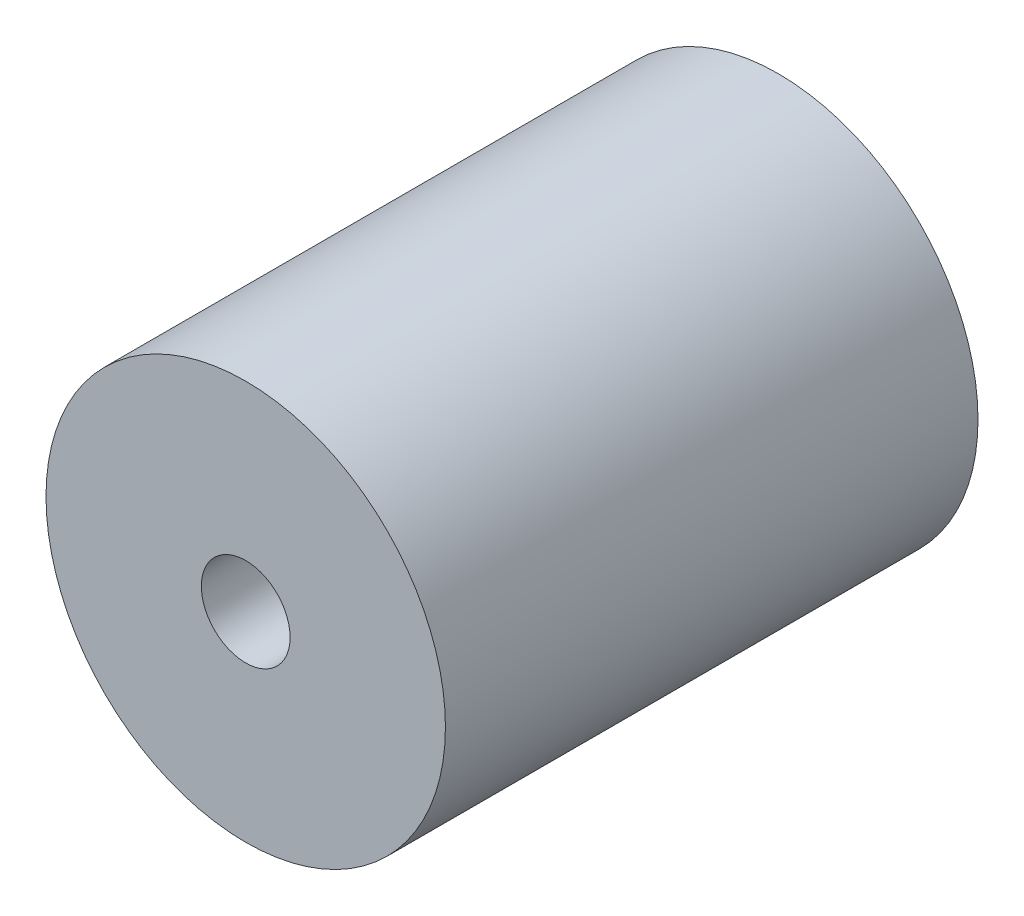
ISO-10303-21;
HEADER;
FILE_DESCRIPTION(('STEP AP214'),'2;1');
FILE_NAME('part.step','',(''),(''),'','','');
FILE_SCHEMA(('AUTOMOTIVE_DESIGN { 1 0 10303 214 1 1 1 1 }'));
ENDSEC;
DATA;
#1=APPLICATION_CONTEXT('core data for automotive mechanical design processes');
#2=APPLICATION_PROTOCOL_DEFINITION('international standard','automotive_design',2000,#1);
#3=PRODUCT_CONTEXT('',#1,'mechanical');
#4=PRODUCT('Part','Part','',(#3));
#5=PRODUCT_RELATED_PRODUCT_CATEGORY('part','',(#4));
#6=PRODUCT_DEFINITION_FORMATION('','',#4);
#7=PRODUCT_DEFINITION_CONTEXT('part definition',#1,'design');
#8=PRODUCT_DEFINITION('design','',#6,#7);
#9=PRODUCT_DEFINITION_SHAPE('','',#8);
#10=(LENGTH_UNIT() NAMED_UNIT(*) SI_UNIT(.MILLI.,.METRE.));
#11=(NAMED_UNIT(*) PLANE_ANGLE_UNIT() SI_UNIT($,.RADIAN.));
#12=(NAMED_UNIT(*) SI_UNIT($,.STERADIAN.) SOLID_ANGLE_UNIT());
#13=UNCERTAINTY_MEASURE_WITH_UNIT(LENGTH_MEASURE(1.E-05),#10,'distance_accuracy_value','');
#14=(GEOMETRIC_REPRESENTATION_CONTEXT(3) GLOBAL_UNCERTAINTY_ASSIGNED_CONTEXT((#13)) GLOBAL_UNIT_ASSIGNED_CONTEXT((#10,
#11,#12)) REPRESENTATION_CONTEXT('',''));
#15=CARTESIAN_POINT('',(0.,0.,0.));
#16=DIRECTION('',(0.,0.,1.));
#17=DIRECTION('',(1.,0.,0.));
#18=AXIS2_PLACEMENT_3D('',#15,#16,#17);
#19=CARTESIAN_POINT('',(0.,0.,38.1));
#20=DIRECTION('',(0.,0.,-1.));
#21=DIRECTION('',(-1.,0.,0.));
#22=AXIS2_PLACEMENT_3D('',#19,#20,#21);
#23=CYLINDRICAL_SURFACE('',#22,14.2875);
#24=CARTESIAN_POINT('',(0.,0.,38.1));
#25=DIRECTION('',(0.,0.,1.));
#26=DIRECTION('',(1.,0.,0.));
#27=AXIS2_PLACEMENT_3D('',#24,#25,#26);
#28=CIRCLE('',#27,14.2875);
#29=CARTESIAN_POINT('',(-14.2875,0.,38.1));
#30=VERTEX_POINT('',#29);
#31=EDGE_CURVE('E10',#30,#30,#28,.T.);
#32=CARTESIAN_POINT('',(0.,0.,0.));
#33=DIRECTION('',(0.,0.,1.));
#34=DIRECTION('',(1.,0.,0.));
#35=AXIS2_PLACEMENT_3D('',#32,#33,#34);
#36=CIRCLE('',#35,14.2875);
#37=CARTESIAN_POINT('',(-14.2875,0.,0.));
#38=VERTEX_POINT('',#37);
#39=EDGE_CURVE('E33',#38,#38,#36,.T.);
#40=CARTESIAN_POINT('',(-14.2875,0.,38.1));
#41=CARTESIAN_POINT('',(-14.2875,0.,37.703125));
#42=CARTESIAN_POINT('',(-14.2875,0.,37.30625));
#43=CARTESIAN_POINT('',(-14.2875,0.,36.5125));
#44=CARTESIAN_POINT('',(-14.2875,0.,36.115625));
#45=CARTESIAN_POINT('',(-14.2875,0.,35.321875));
#46=CARTESIAN_POINT('',(-14.2875,0.,34.925));
#47=CARTESIAN_POINT('',(-14.2875,0.,34.13125));
#48=CARTESIAN_POINT('',(-14.2875,0.,33.734375));
#49=CARTESIAN_POINT('',(-14.2875,0.,32.940625));
#50=CARTESIAN_POINT('',(-14.2875,0.,32.54375));
#51=CARTESIAN_POINT('',(-14.2875,0.,31.75));
#52=CARTESIAN_POINT('',(-14.2875,0.,31.353125));
#53=CARTESIAN_POINT('',(-14.2875,0.,30.559375));
#54=CARTESIAN_POINT('',(-14.2875,0.,30.1625));
#55=CARTESIAN_POINT('',(-14.2875,0.,29.36875));
#56=CARTESIAN_POINT('',(-14.2875,0.,28.971875));
#57=CARTESIAN_POINT('',(-14.2875,0.,28.178125));
#58=CARTESIAN_POINT('',(-14.2875,0.,27.78125));
#59=CARTESIAN_POINT('',(-14.2875,0.,26.9875));
#60=CARTESIAN_POINT('',(-14.2875,0.,26.590625));
#61=CARTESIAN_POINT('',(-14.2875,0.,25.796875));
#62=CARTESIAN_POINT('',(-14.2875,0.,25.4));
#63=CARTESIAN_POINT('',(-14.2875,0.,24.60625));
#64=CARTESIAN_POINT('',(-14.2875,0.,24.209375));
#65=CARTESIAN_POINT('',(-14.2875,0.,23.415625));
#66=CARTESIAN_POINT('',(-14.2875,0.,23.01875));
#67=CARTESIAN_POINT('',(-14.2875,0.,22.225));
#68=CARTESIAN_POINT('',(-14.2875,0.,21.828125));
#69=CARTESIAN_POINT('',(-14.2875,0.,21.034375));
#70=CARTESIAN_POINT('',(-14.2875,0.,20.6375));
#71=CARTESIAN_POINT('',(-14.2875,0.,19.84375));
#72=CARTESIAN_POINT('',(-14.2875,0.,19.446875));
#73=CARTESIAN_POINT('',(-14.2875,0.,18.653125));
#74=CARTESIAN_POINT('',(-14.2875,0.,18.25625));
#75=CARTESIAN_POINT('',(-14.2875,0.,17.4625));
#76=CARTESIAN_POINT('',(-14.2875,0.,17.065625));
#77=CARTESIAN_POINT('',(-14.2875,0.,16.271875));
#78=CARTESIAN_POINT('',(-14.2875,0.,15.875));
#79=CARTESIAN_POINT('',(-14.2875,0.,15.08125));
#80=CARTESIAN_POINT('',(-14.2875,0.,14.684375));
#81=CARTESIAN_POINT('',(-14.2875,0.,13.890625));
#82=CARTESIAN_POINT('',(-14.2875,0.,13.49375));
#83=CARTESIAN_POINT('',(-14.2875,0.,12.7));
#84=CARTESIAN_POINT('',(-14.2875,0.,12.303125));
#85=CARTESIAN_POINT('',(-14.2875,0.,11.509375));
#86=CARTESIAN_POINT('',(-14.2875,0.,11.1125));
#87=CARTESIAN_POINT('',(-14.2875,0.,10.31875));
#88=CARTESIAN_POINT('',(-14.2875,0.,9.921875));
#89=CARTESIAN_POINT('',(-14.2875,0.,9.128125));
#90=CARTESIAN_POINT('',(-14.2875,0.,8.73125));
#91=CARTESIAN_POINT('',(-14.2875,0.,7.9375));
#92=CARTESIAN_POINT('',(-14.2875,0.,7.540625));
#93=CARTESIAN_POINT('',(-14.2875,0.,6.746875));
#94=CARTESIAN_POINT('',(-14.2875,0.,6.35));
#95=CARTESIAN_POINT('',(-14.2875,0.,5.55625));
#96=CARTESIAN_POINT('',(-14.2875,0.,5.159375));
#97=CARTESIAN_POINT('',(-14.2875,0.,4.365625));
#98=CARTESIAN_POINT('',(-14.2875,0.,3.96875));
#99=CARTESIAN_POINT('',(-14.2875,0.,3.175));
#100=CARTESIAN_POINT('',(-14.2875,0.,2.778125));
#101=CARTESIAN_POINT('',(-14.2875,0.,1.984375));
#102=CARTESIAN_POINT('',(-14.2875,0.,1.5875));
#103=CARTESIAN_POINT('',(-14.2875,0.,0.79375));
#104=CARTESIAN_POINT('',(-14.2875,0.,0.396875));
#105=CARTESIAN_POINT('',(-14.2875,0.,0.));
#106=B_SPLINE_CURVE_WITH_KNOTS('',3,(#40,#41,#42,#43,#44,#45,#46,#47,#48,#49,#50,#51,#52,#53,
#54,#55,#56,#57,#58,#59,#60,#61,#62,#63,#64,#65,#66,#67,#68,#69,#70,#71,#72,#73,#74,#75,#76,#77,
#78,#79,#80,#81,#82,#83,#84,#85,#86,#87,#88,#89,#90,#91,#92,#93,#94,#95,#96,#97,#98,#99,#100,
#101,#102,#103,#104,#105),.UNSPECIFIED.,.F.,.F.,(4,2,2,2,2,2,2,2,2,2,2,2,2,2,2,2,2,2,2,2,2,2,2,
2,2,2,2,2,2,2,2,2,4),(0.,1.19062499999999,2.38124999999999,3.571875,4.7625,5.953125,7.14375,
8.33437499999999,9.525,10.715625,11.90625,13.096875,14.2875,15.478125,16.66875,17.859375,19.05,
20.240625,21.43125,22.621875,23.8125,25.003125,26.19375,27.384375,28.575,29.765625,30.95625,
32.146875,33.3375,34.528125,35.71875,36.909375,38.1),.UNSPECIFIED.);
#107=EDGE_CURVE('BSEAM30',#30,#38,#106,.T.);
#108=ORIENTED_EDGE('',*,*,#31,.F.);
#109=ORIENTED_EDGE('',*,*,#39,.T.);
#110=ORIENTED_EDGE('',*,*,#107,.T.);
#111=ORIENTED_EDGE('',*,*,#107,.F.);
#112=EDGE_LOOP('',(#108,#110,#109,#111));
#113=FACE_BOUND('',#112,.T.);
#114=ADVANCED_FACE('F30',(#113),#23,.T.);
#115=CARTESIAN_POINT('',(0.,0.,38.1));
#116=DIRECTION('',(0.,0.,1.));
#117=DIRECTION('',(1.,0.,0.));
#118=AXIS2_PLACEMENT_3D('',#115,#116,#117);
#119=PLANE('',#118);
#120=CARTESIAN_POINT('',(0.,0.,38.1));
#121=DIRECTION('',(0.,0.,1.));
#122=DIRECTION('',(1.,0.,0.));
#123=AXIS2_PLACEMENT_3D('',#120,#121,#122);
#124=CIRCLE('',#123,3.175);
#125=CARTESIAN_POINT('',(3.175,0.,38.1));
#126=VERTEX_POINT('',#125);
#127=EDGE_CURVE('E42',#126,#126,#124,.T.);
#128=ORIENTED_EDGE('',*,*,#127,.F.);
#129=EDGE_LOOP('',(#128));
#130=FACE_BOUND('',#129,.T.);
#131=ORIENTED_EDGE('',*,*,#31,.T.);
#132=EDGE_LOOP('',(#131));
#133=FACE_BOUND('',#132,.T.);
#134=ADVANCED_FACE('F57',(#130,#133),#119,.T.);
#135=CARTESIAN_POINT('',(0.,0.,0.));
#136=DIRECTION('',(0.,0.,1.));
#137=DIRECTION('',(1.,0.,0.));
#138=AXIS2_PLACEMENT_3D('',#135,#136,#137);
#139=PLANE('',#138);
#140=CARTESIAN_POINT('',(0.,0.,0.));
#141=DIRECTION('',(0.,0.,1.));
#142=DIRECTION('',(1.,0.,0.));
#143=AXIS2_PLACEMENT_3D('',#140,#141,#142);
#144=CIRCLE('',#143,3.175);
#145=CARTESIAN_POINT('',(3.175,0.,0.));
#146=VERTEX_POINT('',#145);
#147=EDGE_CURVE('E40',#146,#146,#144,.T.);
#148=ORIENTED_EDGE('',*,*,#147,.T.);
#149=EDGE_LOOP('',(#148));
#150=FACE_BOUND('',#149,.T.);
#151=ORIENTED_EDGE('',*,*,#39,.F.);
#152=EDGE_LOOP('',(#151));
#153=FACE_BOUND('',#152,.T.);
#154=ADVANCED_FACE('F48',(#150,#153),#139,.F.);
#155=CARTESIAN_POINT('',(0.,0.,0.));
#156=DIRECTION('',(0.,0.,1.));
#157=DIRECTION('',(1.,0.,0.));
#158=AXIS2_PLACEMENT_3D('',#155,#156,#157);
#159=CYLINDRICAL_SURFACE('',#158,3.175);
#160=CARTESIAN_POINT('',(3.175,0.,0.));
#161=CARTESIAN_POINT('',(3.175,0.,0.396875));
#162=CARTESIAN_POINT('',(3.175,0.,0.79375));
#163=CARTESIAN_POINT('',(3.175,0.,1.5875));
#164=CARTESIAN_POINT('',(3.175,0.,1.984375));
#165=CARTESIAN_POINT('',(3.175,0.,2.778125));
#166=CARTESIAN_POINT('',(3.175,0.,3.175));
#167=CARTESIAN_POINT('',(3.175,0.,3.96875));
#168=CARTESIAN_POINT('',(3.175,0.,4.365625));
#169=CARTESIAN_POINT('',(3.175,0.,5.159375));
#170=CARTESIAN_POINT('',(3.175,0.,5.55625));
#171=CARTESIAN_POINT('',(3.175,0.,6.35));
#172=CARTESIAN_POINT('',(3.175,0.,6.746875));
#173=CARTESIAN_POINT('',(3.175,0.,7.540625));
#174=CARTESIAN_POINT('',(3.175,0.,7.9375));
#175=CARTESIAN_POINT('',(3.175,0.,8.73125));
#176=CARTESIAN_POINT('',(3.175,0.,9.128125));
#177=CARTESIAN_POINT('',(3.175,0.,9.921875));
#178=CARTESIAN_POINT('',(3.175,0.,10.31875));
#179=CARTESIAN_POINT('',(3.175,0.,11.1125));
#180=CARTESIAN_POINT('',(3.175,0.,11.509375));
#181=CARTESIAN_POINT('',(3.175,0.,12.303125));
#182=CARTESIAN_POINT('',(3.175,0.,12.7));
#183=CARTESIAN_POINT('',(3.175,0.,13.49375));
#184=CARTESIAN_POINT('',(3.175,0.,13.890625));
#185=CARTESIAN_POINT('',(3.175,0.,14.684375));
#186=CARTESIAN_POINT('',(3.175,0.,15.08125));
#187=CARTESIAN_POINT('',(3.175,0.,15.875));
#188=CARTESIAN_POINT('',(3.175,0.,16.271875));
#189=CARTESIAN_POINT('',(3.175,0.,17.065625));
#190=CARTESIAN_POINT('',(3.175,0.,17.4625));
#191=CARTESIAN_POINT('',(3.175,0.,18.25625));
#192=CARTESIAN_POINT('',(3.175,0.,18.653125));
#193=CARTESIAN_POINT('',(3.175,0.,19.446875));
#194=CARTESIAN_POINT('',(3.175,0.,19.84375));
#195=CARTESIAN_POINT('',(3.175,0.,20.6375));
#196=CARTESIAN_POINT('',(3.175,0.,21.034375));
#197=CARTESIAN_POINT('',(3.175,0.,21.828125));
#198=CARTESIAN_POINT('',(3.175,0.,22.225));
#199=CARTESIAN_POINT('',(3.175,0.,23.01875));
#200=CARTESIAN_POINT('',(3.175,0.,23.415625));
#201=CARTESIAN_POINT('',(3.175,0.,24.209375));
#202=CARTESIAN_POINT('',(3.175,0.,24.60625));
#203=CARTESIAN_POINT('',(3.175,0.,25.4));
#204=CARTESIAN_POINT('',(3.175,0.,25.796875));
#205=CARTESIAN_POINT('',(3.175,0.,26.590625));
#206=CARTESIAN_POINT('',(3.175,0.,26.9875));
#207=CARTESIAN_POINT('',(3.175,0.,27.78125));
#208=CARTESIAN_POINT('',(3.175,0.,28.178125));
#209=CARTESIAN_POINT('',(3.175,0.,28.971875));
#210=CARTESIAN_POINT('',(3.175,0.,29.36875));
#211=CARTESIAN_POINT('',(3.175,0.,30.1625));
#212=CARTESIAN_POINT('',(3.175,0.,30.559375));
#213=CARTESIAN_POINT('',(3.175,0.,31.353125));
#214=CARTESIAN_POINT('',(3.175,0.,31.75));
#215=CARTESIAN_POINT('',(3.175,0.,32.54375));
#216=CARTESIAN_POINT('',(3.175,0.,32.940625));
#217=CARTESIAN_POINT('',(3.175,0.,33.734375));
#218=CARTESIAN_POINT('',(3.175,0.,34.13125));
#219=CARTESIAN_POINT('',(3.175,0.,34.925));
#220=CARTESIAN_POINT('',(3.175,0.,35.321875));
#221=CARTESIAN_POINT('',(3.175,0.,36.115625));
#222=CARTESIAN_POINT('',(3.175,0.,36.5125));
#223=CARTESIAN_POINT('',(3.175,0.,37.30625));
#224=CARTESIAN_POINT('',(3.175,0.,37.703125));
#225=CARTESIAN_POINT('',(3.175,0.,38.1));
#226=B_SPLINE_CURVE_WITH_KNOTS('',3,(#160,#161,#162,#163,#164,#165,#166,#167,#168,#169,#170,
#171,#172,#173,#174,#175,#176,#177,#178,#179,#180,#181,#182,#183,#184,#185,#186,#187,#188,#189,
#190,#191,#192,#193,#194,#195,#196,#197,#198,#199,#200,#201,#202,#203,#204,#205,#206,#207,#208,
#209,#210,#211,#212,#213,#214,#215,#216,#217,#218,#219,#220,#221,#222,#223,#224,#225),
.UNSPECIFIED.,.F.,.F.,(4,2,2,2,2,2,2,2,2,2,2,2,2,2,2,2,2,2,2,2,2,2,2,2,2,2,2,2,2,2,2,2,4),(0.,
1.190625,2.38125,3.571875,4.7625,5.953125,7.14375,8.334375,9.525,10.715625,11.90625,13.096875,
14.2875,15.478125,16.66875,17.859375,19.05,20.240625,21.43125,22.621875,23.8125,25.003125,
26.19375,27.384375,28.575,29.765625,30.95625,32.146875,33.3375,34.528125,35.71875,36.909375,
38.1),.UNSPECIFIED.);
#227=EDGE_CURVE('BSEAM51',#146,#126,#226,.T.);
#228=ORIENTED_EDGE('',*,*,#147,.F.);
#229=ORIENTED_EDGE('',*,*,#127,.T.);
#230=ORIENTED_EDGE('',*,*,#227,.T.);
#231=ORIENTED_EDGE('',*,*,#227,.F.);
#232=EDGE_LOOP('',(#228,#230,#229,#231));
#233=FACE_BOUND('',#232,.T.);
#234=ADVANCED_FACE('F51',(#233),#159,.F.);
#235=CLOSED_SHELL('',(#114,#134,#154,#234));
#236=MANIFOLD_SOLID_BREP('B2',#235);
#237=ADVANCED_BREP_SHAPE_REPRESENTATION('',(#18,#236),#14);
#238=SHAPE_DEFINITION_REPRESENTATION(#9,#237);
ENDSEC;
END-ISO-10303-21;
